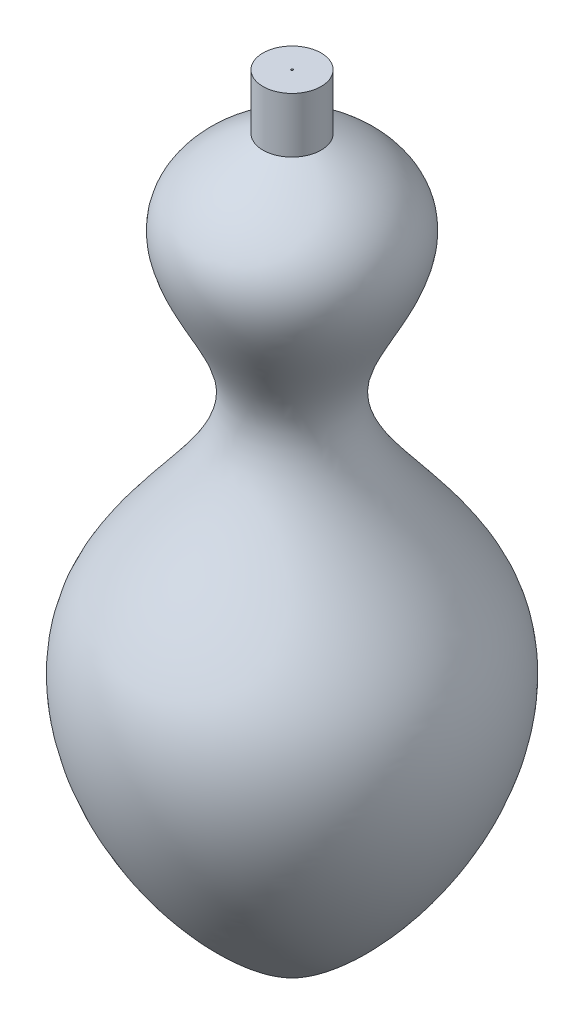
ISO-10303-21;
HEADER;
FILE_DESCRIPTION(('STEP AP214'),'2;1');
FILE_NAME('part.step','',(''),(''),'','','');
FILE_SCHEMA(('AUTOMOTIVE_DESIGN { 1 0 10303 214 1 1 1 1 }'));
ENDSEC;
DATA;
#1=APPLICATION_CONTEXT('core data for automotive mechanical design processes');
#2=APPLICATION_PROTOCOL_DEFINITION('international standard','automotive_design',2000,#1);
#3=PRODUCT_CONTEXT('',#1,'mechanical');
#4=PRODUCT('Part','Part','',(#3));
#5=PRODUCT_RELATED_PRODUCT_CATEGORY('part','',(#4));
#6=PRODUCT_DEFINITION_FORMATION('','',#4);
#7=PRODUCT_DEFINITION_CONTEXT('part definition',#1,'design');
#8=PRODUCT_DEFINITION('design','',#6,#7);
#9=PRODUCT_DEFINITION_SHAPE('','',#8);
#10=(LENGTH_UNIT() NAMED_UNIT(*) SI_UNIT(.MILLI.,.METRE.));
#11=(NAMED_UNIT(*) PLANE_ANGLE_UNIT() SI_UNIT($,.RADIAN.));
#12=(NAMED_UNIT(*) SI_UNIT($,.STERADIAN.) SOLID_ANGLE_UNIT());
#13=UNCERTAINTY_MEASURE_WITH_UNIT(LENGTH_MEASURE(1.E-05),#10,'distance_accuracy_value','');
#14=(GEOMETRIC_REPRESENTATION_CONTEXT(3) GLOBAL_UNCERTAINTY_ASSIGNED_CONTEXT((#13)) GLOBAL_UNIT_ASSIGNED_CONTEXT((#10,
#11,#12)) REPRESENTATION_CONTEXT('',''));
#15=CARTESIAN_POINT('',(0.,0.,0.));
#16=DIRECTION('',(0.,0.,1.));
#17=DIRECTION('',(1.,0.,0.));
#18=AXIS2_PLACEMENT_3D('',#15,#16,#17);
#19=CARTESIAN_POINT('',(7.5,157.486099745262,0.));
#20=DIRECTION('',(0.,1.,0.));
#21=DIRECTION('',(0.,0.,1.));
#22=AXIS2_PLACEMENT_3D('',#19,#20,#21);
#23=PLANE('',#22);
#24=CARTESIAN_POINT('',(0.,157.486099745262,0.));
#25=DIRECTION('',(0.,-1.,0.));
#26=DIRECTION('',(0.,0.,-1.));
#27=AXIS2_PLACEMENT_3D('',#24,#25,#26);
#28=CIRCLE('',#27,0.294737116838948);
#29=CARTESIAN_POINT('',(0.,157.486099745262,-0.294737116838948));
#30=VERTEX_POINT('',#29);
#31=EDGE_CURVE('E73',#30,#30,#28,.T.);
#32=ORIENTED_EDGE('',*,*,#31,.T.);
#33=EDGE_LOOP('',(#32));
#34=FACE_BOUND('',#33,.T.);
#35=CARTESIAN_POINT('',(0.,157.486099745262,0.));
#36=DIRECTION('',(0.,-1.,0.));
#37=DIRECTION('',(0.,0.,-1.));
#38=AXIS2_PLACEMENT_3D('',#35,#36,#37);
#39=CIRCLE('',#38,8.);
#40=CARTESIAN_POINT('',(0.,157.486099745262,-8.));
#41=VERTEX_POINT('',#40);
#42=EDGE_CURVE('E10',#41,#41,#39,.T.);
#43=ORIENTED_EDGE('',*,*,#42,.F.);
#44=EDGE_LOOP('',(#43));
#45=FACE_BOUND('',#44,.T.);
#46=ADVANCED_FACE('F39',(#34,#45),#23,.T.);
#47=CARTESIAN_POINT('',(0.,0.,0.));
#48=DIRECTION('',(0.,-1.,0.));
#49=DIRECTION('',(0.,0.,-1.));
#50=AXIS2_PLACEMENT_3D('',#47,#48,#49);
#51=CYLINDRICAL_SURFACE('',#50,8.);
#52=ORIENTED_EDGE('',*,*,#42,.T.);
#53=EDGE_LOOP('',(#52));
#54=FACE_BOUND('',#53,.T.);
#55=CARTESIAN_POINT('',(0.,142.301827396975,0.));
#56=DIRECTION('',(0.,-1.,0.));
#57=DIRECTION('',(0.,0.,-1.));
#58=AXIS2_PLACEMENT_3D('',#55,#56,#57);
#59=CIRCLE('',#58,8.);
#60=CARTESIAN_POINT('',(0.,142.301827396975,-8.));
#61=VERTEX_POINT('',#60);
#62=EDGE_CURVE('E45',#61,#61,#59,.T.);
#63=ORIENTED_EDGE('',*,*,#62,.F.);
#64=EDGE_LOOP('',(#63));
#65=FACE_BOUND('',#64,.T.);
#66=ADVANCED_FACE('F91',(#54,#65),#51,.T.);
#67=CARTESIAN_POINT('',(9.6337504006214,-52.2058269765274,0.));
#68=CARTESIAN_POINT('',(10.0242990657337,-51.9296048444212,0.));
#69=CARTESIAN_POINT('',(10.4205832011349,-51.6455061449674,0.));
#70=CARTESIAN_POINT('',(11.2118290713377,-51.0630171500461,0.));
#71=CARTESIAN_POINT('',(12.4019282438831,-50.1677229999716,0.));
#72=CARTESIAN_POINT('',(13.5995058194584,-49.2093775050565,0.));
#73=CARTESIAN_POINT('',(15.9986823296524,-47.2129603261381,0.));
#74=CARTESIAN_POINT('',(17.6035046936253,-45.7757141999196,0.));
#75=CARTESIAN_POINT('',(22.3860198173946,-41.1797758156349,0.));
#76=CARTESIAN_POINT('',(25.5318247930522,-37.7368905898153,0.));
#77=CARTESIAN_POINT('',(34.4529873440781,-26.5488721076242,0.));
#78=CARTESIAN_POINT('',(39.7129973305267,-17.944888776818,0.));
#79=CARTESIAN_POINT('',(44.9994979682242,-4.42486798754276,0.));
#80=CARTESIAN_POINT('',(46.3275523066738,0.184360254768508,0.));
#81=CARTESIAN_POINT('',(47.8483610285761,9.42402780870531,0.));
#82=CARTESIAN_POINT('',(48.0410083664658,14.0547996735453,0.));
#83=CARTESIAN_POINT('',(47.2747703849234,20.8742885096329,0.));
#84=CARTESIAN_POINT('',(46.8434578083253,23.1262415456361,0.));
#85=CARTESIAN_POINT('',(45.9074870450158,26.4534644377339,0.));
#86=CARTESIAN_POINT('',(45.547335417836,27.5540800133672,0.));
#87=CARTESIAN_POINT('',(44.7266101326718,29.7351786446397,0.));
#88=CARTESIAN_POINT('',(44.2646969741189,30.8151471177689,0.));
#89=CARTESIAN_POINT('',(41.7284765365303,36.1568931939443,0.));
#90=CARTESIAN_POINT('',(38.981801436099,40.2538886321979,0.));
#91=CARTESIAN_POINT('',(32.9900348541016,48.2358098818508,0.));
#92=CARTESIAN_POINT('',(29.7440797710544,52.1209934680023,0.));
#93=CARTESIAN_POINT('',(23.6784167756635,59.8029943352142,0.));
#94=CARTESIAN_POINT('',(20.859325906299,63.6001028341974,0.));
#95=CARTESIAN_POINT('',(17.6414569999605,69.3044484536777,0.));
#96=CARTESIAN_POINT('',(16.7372337587396,71.2070024531725,0.));
#97=CARTESIAN_POINT('',(15.3759211011081,75.0256450776315,0.));
#98=CARTESIAN_POINT('',(14.9187203537577,76.9413573461264,0.));
#99=CARTESIAN_POINT('',(14.6470570129079,79.8385845133727,0.));
#100=CARTESIAN_POINT('',(14.6254908269747,80.808381012669,0.));
#101=CARTESIAN_POINT('',(14.733877354053,82.7597948194754,0.));
#102=CARTESIAN_POINT('',(14.8663448058516,83.7408835095135,0.));
#103=CARTESIAN_POINT('',(15.4908555556881,86.7185641430339,0.));
#104=CARTESIAN_POINT('',(16.1996490837724,88.7446845409169,0.));
#105=CARTESIAN_POINT('',(18.8504028066657,94.9138760638013,0.));
#106=CARTESIAN_POINT('',(21.3161559467153,99.1434326946228,0.));
#107=CARTESIAN_POINT('',(24.5842746412266,105.578204515981,0.));
#108=CARTESIAN_POINT('',(25.6017888517934,107.739015451676,0.));
#109=CARTESIAN_POINT('',(27.2427234198308,112.086932809728,0.));
#110=CARTESIAN_POINT('',(27.8664549267389,114.274551425443,0.));
#111=CARTESIAN_POINT('',(28.4595668103481,118.670728931256,0.));
#112=CARTESIAN_POINT('',(28.4278027002944,120.880302169493,0.));
#113=CARTESIAN_POINT('',(27.4433662744426,125.287881574852,0.));
#114=CARTESIAN_POINT('',(26.4902755965806,127.483239370261,0.));
#115=CARTESIAN_POINT('',(23.4354043764726,131.816640731419,0.));
#116=CARTESIAN_POINT('',(21.3354782312725,133.955334335238,0.));
#117=CARTESIAN_POINT('',(15.7610657535581,138.172625271883,0.));
#118=CARTESIAN_POINT('',(12.2860536704576,140.252051998434,0.));
#119=CARTESIAN_POINT('',(7.99999999999995,142.301827396975,0.));
#120=B_SPLINE_CURVE_WITH_KNOTS('',3,(#67,#68,#69,#70,#71,#72,#73,#74,#75,#76,#77,#78,#79,#80,
#81,#82,#83,#84,#85,#86,#87,#88,#89,#90,#91,#92,#93,#94,#95,#96,#97,#98,#99,#100,#101,#102,#103,
#104,#105,#106,#107,#108,#109,#110,#111,#112,#113,#114,#115,#116,#117,#118,#119),.UNSPECIFIED.,
.F.,.F.,(4,2,1,2,2,2,2,2,2,2,2,2,2,2,2,2,2,2,2,2,2,2,2,2,2,2,4),(0.,0.00781250000000003,
0.0156250000000001,0.03125,0.0625,0.125,0.249999999999999,0.312499999999999,0.374999999999999,
0.406249999999999,0.421874999999999,0.437499999999999,0.499999999999999,0.562499999999999,
0.624999999999999,0.656249999999999,0.687499999999999,0.703124999999999,0.718749999999999,
0.749999999999999,0.812499999999999,0.843749999999999,0.875,0.90625,0.9375,0.96875,1.),.UNSPECIFIED.);
#121=CARTESIAN_POINT('',(0.,0.,0.));
#122=DIRECTION('',(0.,-1.,0.));
#123=AXIS1_PLACEMENT('',#121,#122);
#124=SURFACE_OF_REVOLUTION('',#120,#123);
#125=ORIENTED_EDGE('',*,*,#62,.T.);
#126=EDGE_LOOP('',(#125));
#127=FACE_BOUND('',#126,.T.);
#128=CARTESIAN_POINT('',(0.,-52.2058269765274,0.));
#129=DIRECTION('',(0.,-1.,0.));
#130=DIRECTION('',(0.,0.,-1.));
#131=AXIS2_PLACEMENT_3D('',#128,#129,#130);
#132=CIRCLE('',#131,9.63375040062141);
#133=CARTESIAN_POINT('',(0.,-52.2058269765274,-9.63375040062141));
#134=VERTEX_POINT('',#133);
#135=EDGE_CURVE('E49',#134,#134,#132,.T.);
#136=ORIENTED_EDGE('',*,*,#135,.F.);
#137=EDGE_LOOP('',(#136));
#138=FACE_BOUND('',#137,.T.);
#139=ADVANCED_FACE('F87',(#127,#138),#124,.F.);
#140=CARTESIAN_POINT('',(1.75170528465193,-52.2058269765274,0.));
#141=DIRECTION('',(0.,-1.,0.));
#142=DIRECTION('',(0.,0.,-1.));
#143=AXIS2_PLACEMENT_3D('',#140,#141,#142);
#144=PLANE('',#143);
#145=ORIENTED_EDGE('',*,*,#135,.T.);
#146=EDGE_LOOP('',(#145));
#147=FACE_BOUND('',#146,.T.);
#148=CARTESIAN_POINT('',(0.,-52.2058269765274,0.));
#149=DIRECTION('',(0.,-1.,0.));
#150=DIRECTION('',(0.,0.,-1.));
#151=AXIS2_PLACEMENT_3D('',#148,#149,#150);
#152=CIRCLE('',#151,1.75170528465193);
#153=CARTESIAN_POINT('',(0.,-52.2058269765274,-1.75170528465193));
#154=VERTEX_POINT('',#153);
#155=EDGE_CURVE('E53',#154,#154,#152,.T.);
#156=ORIENTED_EDGE('',*,*,#155,.F.);
#157=EDGE_LOOP('',(#156));
#158=FACE_BOUND('',#157,.T.);
#159=ADVANCED_FACE('F90',(#147,#158),#144,.T.);
#160=CARTESIAN_POINT('',(0.,0.,0.));
#161=DIRECTION('',(0.,-1.,0.));
#162=DIRECTION('',(0.,0.,-1.));
#163=AXIS2_PLACEMENT_3D('',#160,#161,#162);
#164=CYLINDRICAL_SURFACE('',#163,1.75170528465193);
#165=CARTESIAN_POINT('',(0.,-51.7058269765274,0.));
#166=DIRECTION('',(0.,-1.,0.));
#167=DIRECTION('',(0.,0.,-1.));
#168=AXIS2_PLACEMENT_3D('',#165,#166,#167);
#169=CIRCLE('',#168,1.75170528465193);
#170=CARTESIAN_POINT('',(0.,-51.7058269765274,-1.75170528465193));
#171=VERTEX_POINT('',#170);
#172=EDGE_CURVE('E58',#171,#171,#169,.T.);
#173=ORIENTED_EDGE('',*,*,#172,.F.);
#174=EDGE_LOOP('',(#173));
#175=FACE_BOUND('',#174,.T.);
#176=ORIENTED_EDGE('',*,*,#155,.T.);
#177=EDGE_LOOP('',(#176));
#178=FACE_BOUND('',#177,.T.);
#179=ADVANCED_FACE('F131',(#175,#178),#164,.F.);
#180=CARTESIAN_POINT('',(1.75170528465193,-51.7058269765274,0.));
#181=DIRECTION('',(0.,-1.,0.));
#182=DIRECTION('',(0.,0.,-1.));
#183=AXIS2_PLACEMENT_3D('',#180,#181,#182);
#184=PLANE('',#183);
#185=CARTESIAN_POINT('',(0.,-51.7058269765274,0.));
#186=DIRECTION('',(0.,-1.,0.));
#187=DIRECTION('',(0.,0.,-1.));
#188=AXIS2_PLACEMENT_3D('',#185,#186,#187);
#189=CIRCLE('',#188,9.47480240282736);
#190=CARTESIAN_POINT('',(0.,-51.7058269765274,-9.47480240282736));
#191=VERTEX_POINT('',#190);
#192=EDGE_CURVE('E61',#191,#191,#189,.T.);
#193=ORIENTED_EDGE('',*,*,#192,.F.);
#194=EDGE_LOOP('',(#193));
#195=FACE_BOUND('',#194,.T.);
#196=ORIENTED_EDGE('',*,*,#172,.T.);
#197=EDGE_LOOP('',(#196));
#198=FACE_BOUND('',#197,.T.);
#199=ADVANCED_FACE('F125',(#195,#198),#184,.F.);
#200=CARTESIAN_POINT('',(9.47480240282737,-51.7058269765274,0.));
#201=CARTESIAN_POINT('',(30.7466994772738,-36.6609189055762,0.));
#202=CARTESIAN_POINT('',(73.1004281422532,24.8997290374185,0.));
#203=CARTESIAN_POINT('',(-13.1335271252575,81.3105103732225,0.));
#204=CARTESIAN_POINT('',(47.3504901908851,123.098772602896,0.));
#205=CARTESIAN_POINT('',(7.5,141.986099745262,0.));
#206=B_SPLINE_CURVE_WITH_KNOTS('',3,(#200,#201,#202,#203,#204,#205),.UNSPECIFIED.,.F.,.F.,(4,1,
1,4),(0.,0.42559492506552,0.710229213744248,1.),.UNSPECIFIED.);
#207=CARTESIAN_POINT('',(0.,0.,0.));
#208=DIRECTION('',(0.,-1.,0.));
#209=AXIS1_PLACEMENT('',#207,#208);
#210=SURFACE_OF_REVOLUTION('',#206,#209);
#211=CARTESIAN_POINT('',(0.,141.986099745262,0.));
#212=DIRECTION('',(0.,-1.,0.));
#213=DIRECTION('',(0.,0.,-1.));
#214=AXIS2_PLACEMENT_3D('',#211,#212,#213);
#215=CIRCLE('',#214,7.5);
#216=CARTESIAN_POINT('',(0.,141.986099745262,-7.5));
#217=VERTEX_POINT('',#216);
#218=EDGE_CURVE('E64',#217,#217,#215,.T.);
#219=ORIENTED_EDGE('',*,*,#218,.F.);
#220=EDGE_LOOP('',(#219));
#221=FACE_BOUND('',#220,.T.);
#222=ORIENTED_EDGE('',*,*,#192,.T.);
#223=EDGE_LOOP('',(#222));
#224=FACE_BOUND('',#223,.T.);
#225=ADVANCED_FACE('F119',(#221,#224),#210,.T.);
#226=CARTESIAN_POINT('',(0.,0.,0.));
#227=DIRECTION('',(0.,-1.,0.));
#228=DIRECTION('',(0.,0.,-1.));
#229=AXIS2_PLACEMENT_3D('',#226,#227,#228);
#230=CYLINDRICAL_SURFACE('',#229,7.5);
#231=CARTESIAN_POINT('',(0.,156.986099745262,0.));
#232=DIRECTION('',(0.,-1.,0.));
#233=DIRECTION('',(0.,0.,-1.));
#234=AXIS2_PLACEMENT_3D('',#231,#232,#233);
#235=CIRCLE('',#234,7.5);
#236=CARTESIAN_POINT('',(0.,156.986099745262,-7.5));
#237=VERTEX_POINT('',#236);
#238=EDGE_CURVE('E67',#237,#237,#235,.T.);
#239=ORIENTED_EDGE('',*,*,#238,.F.);
#240=EDGE_LOOP('',(#239));
#241=FACE_BOUND('',#240,.T.);
#242=ORIENTED_EDGE('',*,*,#218,.T.);
#243=EDGE_LOOP('',(#242));
#244=FACE_BOUND('',#243,.T.);
#245=ADVANCED_FACE('F113',(#241,#244),#230,.F.);
#246=CARTESIAN_POINT('',(7.5,156.986099745262,0.));
#247=DIRECTION('',(0.,1.,0.));
#248=DIRECTION('',(0.,0.,1.));
#249=AXIS2_PLACEMENT_3D('',#246,#247,#248);
#250=PLANE('',#249);
#251=CARTESIAN_POINT('',(0.,156.986099745262,0.));
#252=DIRECTION('',(0.,-1.,0.));
#253=DIRECTION('',(0.,0.,-1.));
#254=AXIS2_PLACEMENT_3D('',#251,#252,#253);
#255=CIRCLE('',#254,0.294737116838948);
#256=CARTESIAN_POINT('',(0.,156.986099745262,-0.294737116838948));
#257=VERTEX_POINT('',#256);
#258=EDGE_CURVE('E70',#257,#257,#255,.T.);
#259=ORIENTED_EDGE('',*,*,#258,.F.);
#260=EDGE_LOOP('',(#259));
#261=FACE_BOUND('',#260,.T.);
#262=ORIENTED_EDGE('',*,*,#238,.T.);
#263=EDGE_LOOP('',(#262));
#264=FACE_BOUND('',#263,.T.);
#265=ADVANCED_FACE('F107',(#261,#264),#250,.F.);
#266=CARTESIAN_POINT('',(0.,0.,0.));
#267=DIRECTION('',(0.,-1.,0.));
#268=DIRECTION('',(0.,0.,-1.));
#269=AXIS2_PLACEMENT_3D('',#266,#267,#268);
#270=CYLINDRICAL_SURFACE('',#269,0.294737116838948);
#271=ORIENTED_EDGE('',*,*,#31,.F.);
#272=EDGE_LOOP('',(#271));
#273=FACE_BOUND('',#272,.T.);
#274=ORIENTED_EDGE('',*,*,#258,.T.);
#275=EDGE_LOOP('',(#274));
#276=FACE_BOUND('',#275,.T.);
#277=ADVANCED_FACE('F104',(#273,#276),#270,.F.);
#278=CLOSED_SHELL('',(#46,#66,#139,#159,#179,#199,#225,#245,#265,#277));
#279=MANIFOLD_SOLID_BREP('B2',#278);
#280=ADVANCED_BREP_SHAPE_REPRESENTATION('',(#18,#279),#14);
#281=SHAPE_DEFINITION_REPRESENTATION(#9,#280);
ENDSEC;
END-ISO-10303-21;
